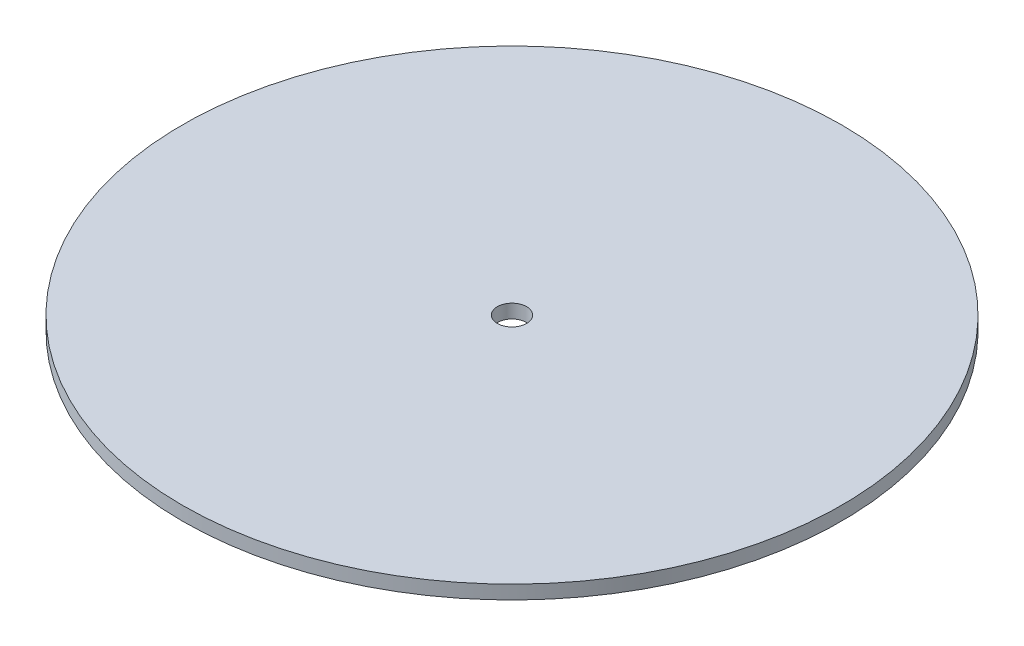
ISO-10303-21;
HEADER;
FILE_DESCRIPTION(('STEP AP214'),'2;1');
FILE_NAME('part.step','',(''),(''),'','','');
FILE_SCHEMA(('AUTOMOTIVE_DESIGN { 1 0 10303 214 1 1 1 1 }'));
ENDSEC;
DATA;
#1=APPLICATION_CONTEXT('core data for automotive mechanical design processes');
#2=APPLICATION_PROTOCOL_DEFINITION('international standard','automotive_design',2000,#1);
#3=PRODUCT_CONTEXT('',#1,'mechanical');
#4=PRODUCT('Part','Part','',(#3));
#5=PRODUCT_RELATED_PRODUCT_CATEGORY('part','',(#4));
#6=PRODUCT_DEFINITION_FORMATION('','',#4);
#7=PRODUCT_DEFINITION_CONTEXT('part definition',#1,'design');
#8=PRODUCT_DEFINITION('design','',#6,#7);
#9=PRODUCT_DEFINITION_SHAPE('','',#8);
#10=(LENGTH_UNIT() NAMED_UNIT(*) SI_UNIT(.MILLI.,.METRE.));
#11=(NAMED_UNIT(*) PLANE_ANGLE_UNIT() SI_UNIT($,.RADIAN.));
#12=(NAMED_UNIT(*) SI_UNIT($,.STERADIAN.) SOLID_ANGLE_UNIT());
#13=UNCERTAINTY_MEASURE_WITH_UNIT(LENGTH_MEASURE(1.E-05),#10,'distance_accuracy_value','');
#14=(GEOMETRIC_REPRESENTATION_CONTEXT(3) GLOBAL_UNCERTAINTY_ASSIGNED_CONTEXT((#13)) GLOBAL_UNIT_ASSIGNED_CONTEXT((#10,
#11,#12)) REPRESENTATION_CONTEXT('',''));
#15=CARTESIAN_POINT('',(0.,0.,0.));
#16=DIRECTION('',(0.,0.,1.));
#17=DIRECTION('',(1.,0.,0.));
#18=AXIS2_PLACEMENT_3D('',#15,#16,#17);
#19=CARTESIAN_POINT('',(0.,3.175,0.));
#20=DIRECTION('',(0.,-1.,0.));
#21=DIRECTION('',(0.,0.,-1.));
#22=AXIS2_PLACEMENT_3D('',#19,#20,#21);
#23=CYLINDRICAL_SURFACE('',#22,76.2);
#24=CARTESIAN_POINT('',(0.,3.175,0.));
#25=DIRECTION('',(0.,1.,0.));
#26=DIRECTION('',(0.,0.,1.));
#27=AXIS2_PLACEMENT_3D('',#24,#25,#26);
#28=CIRCLE('',#27,76.2);
#29=CARTESIAN_POINT('',(0.,3.175,76.2));
#30=VERTEX_POINT('',#29);
#31=EDGE_CURVE('E10',#30,#30,#28,.T.);
#32=ORIENTED_EDGE('',*,*,#31,.F.);
#33=EDGE_LOOP('',(#32));
#34=FACE_BOUND('',#33,.T.);
#35=CARTESIAN_POINT('',(0.,0.,0.));
#36=DIRECTION('',(0.,1.,0.));
#37=DIRECTION('',(0.,0.,1.));
#38=AXIS2_PLACEMENT_3D('',#35,#36,#37);
#39=CIRCLE('',#38,76.2);
#40=CARTESIAN_POINT('',(0.,0.,76.2));
#41=VERTEX_POINT('',#40);
#42=EDGE_CURVE('E40',#41,#41,#39,.T.);
#43=ORIENTED_EDGE('',*,*,#42,.T.);
#44=EDGE_LOOP('',(#43));
#45=FACE_BOUND('',#44,.T.);
#46=ADVANCED_FACE('F37',(#34,#45),#23,.T.);
#47=CARTESIAN_POINT('',(0.,3.175,0.));
#48=DIRECTION('',(0.,1.,0.));
#49=DIRECTION('',(0.,0.,1.));
#50=AXIS2_PLACEMENT_3D('',#47,#48,#49);
#51=PLANE('',#50);
#52=CARTESIAN_POINT('',(0.,3.175,0.));
#53=DIRECTION('',(0.,1.,0.));
#54=DIRECTION('',(0.,0.,1.));
#55=AXIS2_PLACEMENT_3D('',#52,#53,#54);
#56=CIRCLE('',#55,3.3782);
#57=CARTESIAN_POINT('',(0.,3.175,3.3782));
#58=VERTEX_POINT('',#57);
#59=EDGE_CURVE('E54',#58,#58,#56,.T.);
#60=ORIENTED_EDGE('',*,*,#59,.F.);
#61=EDGE_LOOP('',(#60));
#62=FACE_BOUND('',#61,.T.);
#63=ORIENTED_EDGE('',*,*,#31,.T.);
#64=EDGE_LOOP('',(#63));
#65=FACE_BOUND('',#64,.T.);
#66=ADVANCED_FACE('F61',(#62,#65),#51,.T.);
#67=CARTESIAN_POINT('',(0.,0.,0.));
#68=DIRECTION('',(0.,1.,0.));
#69=DIRECTION('',(0.,0.,1.));
#70=AXIS2_PLACEMENT_3D('',#67,#68,#69);
#71=PLANE('',#70);
#72=CARTESIAN_POINT('',(0.,0.,0.));
#73=DIRECTION('',(0.,1.,0.));
#74=DIRECTION('',(0.,0.,1.));
#75=AXIS2_PLACEMENT_3D('',#72,#73,#74);
#76=CIRCLE('',#75,3.3782);
#77=CARTESIAN_POINT('',(0.,0.,3.3782));
#78=VERTEX_POINT('',#77);
#79=EDGE_CURVE('E49',#78,#78,#76,.T.);
#80=ORIENTED_EDGE('',*,*,#79,.T.);
#81=EDGE_LOOP('',(#80));
#82=FACE_BOUND('',#81,.T.);
#83=ORIENTED_EDGE('',*,*,#42,.F.);
#84=EDGE_LOOP('',(#83));
#85=FACE_BOUND('',#84,.T.);
#86=ADVANCED_FACE('F63',(#82,#85),#71,.F.);
#87=CARTESIAN_POINT('',(0.,3.175,0.));
#88=DIRECTION('',(0.,1.,0.));
#89=DIRECTION('',(0.,0.,1.));
#90=AXIS2_PLACEMENT_3D('',#87,#88,#89);
#91=CYLINDRICAL_SURFACE('',#90,3.3782);
#92=ORIENTED_EDGE('',*,*,#79,.F.);
#93=EDGE_LOOP('',(#92));
#94=FACE_BOUND('',#93,.T.);
#95=ORIENTED_EDGE('',*,*,#59,.T.);
#96=EDGE_LOOP('',(#95));
#97=FACE_BOUND('',#96,.T.);
#98=ADVANCED_FACE('F59',(#94,#97),#91,.F.);
#99=CLOSED_SHELL('',(#46,#66,#86,#98));
#100=MANIFOLD_SOLID_BREP('B2',#99);
#101=ADVANCED_BREP_SHAPE_REPRESENTATION('',(#18,#100),#14);
#102=SHAPE_DEFINITION_REPRESENTATION(#9,#101);
ENDSEC;
END-ISO-10303-21;
